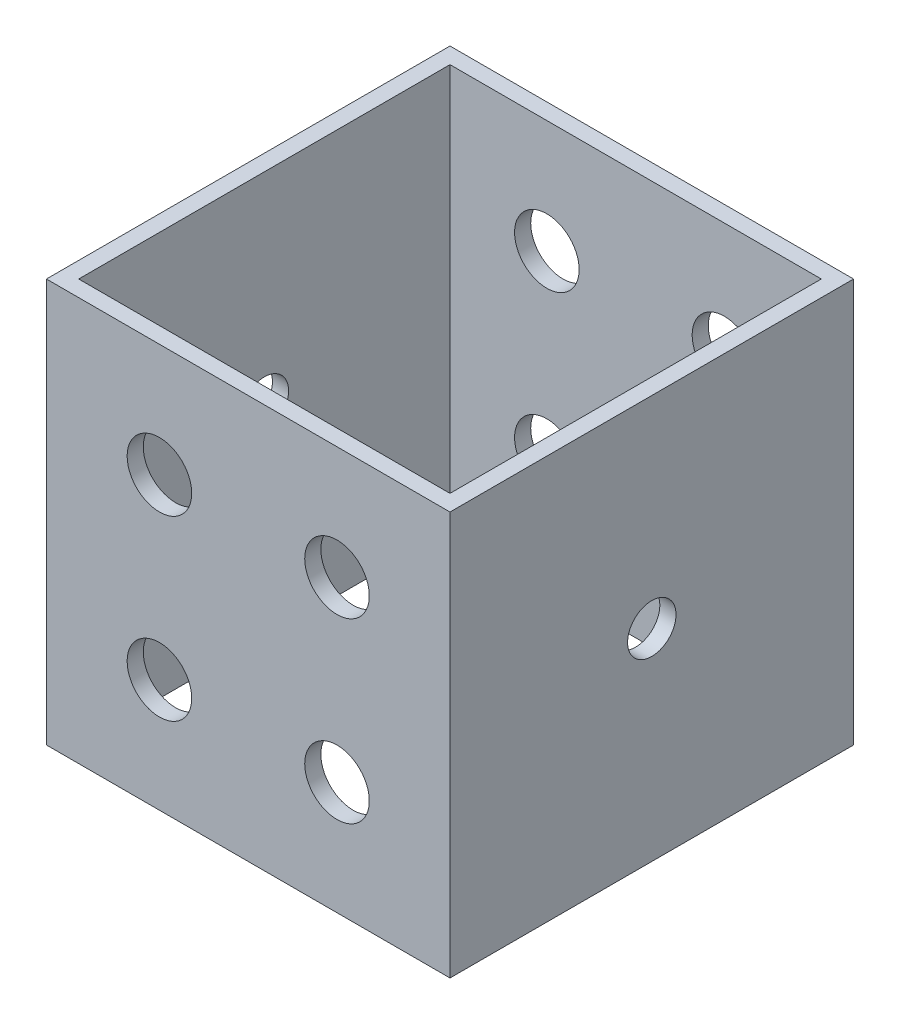
ISO-10303-21;
HEADER;
FILE_DESCRIPTION(('STEP AP214'),'2;1');
FILE_NAME('part.step','',(''),(''),'','','');
FILE_SCHEMA(('AUTOMOTIVE_DESIGN { 1 0 10303 214 1 1 1 1 }'));
ENDSEC;
DATA;
#1=APPLICATION_CONTEXT('core data for automotive mechanical design processes');
#2=APPLICATION_PROTOCOL_DEFINITION('international standard','automotive_design',2000,#1);
#3=PRODUCT_CONTEXT('',#1,'mechanical');
#4=PRODUCT('Part','Part','',(#3));
#5=PRODUCT_RELATED_PRODUCT_CATEGORY('part','',(#4));
#6=PRODUCT_DEFINITION_FORMATION('','',#4);
#7=PRODUCT_DEFINITION_CONTEXT('part definition',#1,'design');
#8=PRODUCT_DEFINITION('design','',#6,#7);
#9=PRODUCT_DEFINITION_SHAPE('','',#8);
#10=(LENGTH_UNIT() NAMED_UNIT(*) SI_UNIT(.MILLI.,.METRE.));
#11=(NAMED_UNIT(*) PLANE_ANGLE_UNIT() SI_UNIT($,.RADIAN.));
#12=(NAMED_UNIT(*) SI_UNIT($,.STERADIAN.) SOLID_ANGLE_UNIT());
#13=UNCERTAINTY_MEASURE_WITH_UNIT(LENGTH_MEASURE(1.E-05),#10,'distance_accuracy_value','');
#14=(GEOMETRIC_REPRESENTATION_CONTEXT(3) GLOBAL_UNCERTAINTY_ASSIGNED_CONTEXT((#13)) GLOBAL_UNIT_ASSIGNED_CONTEXT((#10,
#11,#12)) REPRESENTATION_CONTEXT('',''));
#15=CARTESIAN_POINT('',(0.,0.,0.));
#16=DIRECTION('',(0.,0.,1.));
#17=DIRECTION('',(1.,0.,0.));
#18=AXIS2_PLACEMENT_3D('',#15,#16,#17);
#19=CARTESIAN_POINT('',(12.5,-12.5,-12.5));
#20=DIRECTION('',(1.,0.,0.));
#21=DIRECTION('',(0.,0.,-1.));
#22=AXIS2_PLACEMENT_3D('',#19,#20,#21);
#23=PLANE('',#22);
#24=CARTESIAN_POINT('',(12.5,0.,0.));
#25=DIRECTION('',(1.,0.,0.));
#26=DIRECTION('',(0.,0.,-1.));
#27=AXIS2_PLACEMENT_3D('',#24,#25,#26);
#28=CIRCLE('',#27,1.5);
#29=CARTESIAN_POINT('',(12.5,0.,-1.5));
#30=VERTEX_POINT('',#29);
#31=EDGE_CURVE('E219',#30,#30,#28,.T.);
#32=ORIENTED_EDGE('',*,*,#31,.F.);
#33=EDGE_LOOP('',(#32));
#34=FACE_BOUND('',#33,.T.);
#35=DIRECTION('',(0.,1.,0.));
#36=VECTOR('',#35,1.);
#37=CARTESIAN_POINT('',(12.5,-12.5,-12.5));
#38=LINE('',#37,#36);
#39=CARTESIAN_POINT('',(12.5,-12.5,-12.5));
#40=VERTEX_POINT('',#39);
#41=CARTESIAN_POINT('',(12.5,12.5,-12.5));
#42=VERTEX_POINT('',#41);
#43=EDGE_CURVE('E161',#40,#42,#38,.T.);
#44=ORIENTED_EDGE('',*,*,#43,.T.);
#45=DIRECTION('',(0.,0.,-1.));
#46=VECTOR('',#45,1.);
#47=CARTESIAN_POINT('',(12.5,12.5,-12.5));
#48=LINE('',#47,#46);
#49=CARTESIAN_POINT('',(12.5,12.5,12.5));
#50=VERTEX_POINT('',#49);
#51=EDGE_CURVE('E129',#50,#42,#48,.T.);
#52=ORIENTED_EDGE('',*,*,#51,.F.);
#53=DIRECTION('',(0.,1.,0.));
#54=VECTOR('',#53,1.);
#55=CARTESIAN_POINT('',(12.5,-12.5,12.5));
#56=LINE('',#55,#54);
#57=CARTESIAN_POINT('',(12.5,-12.5,12.5));
#58=VERTEX_POINT('',#57);
#59=EDGE_CURVE('E11',#58,#50,#56,.T.);
#60=ORIENTED_EDGE('',*,*,#59,.F.);
#61=DIRECTION('',(0.,0.,-1.));
#62=VECTOR('',#61,1.);
#63=CARTESIAN_POINT('',(12.5,-12.5,-12.5));
#64=LINE('',#63,#62);
#65=EDGE_CURVE('E148',#58,#40,#64,.T.);
#66=ORIENTED_EDGE('',*,*,#65,.T.);
#67=EDGE_LOOP('',(#44,#52,#60,#66));
#68=FACE_BOUND('',#67,.T.);
#69=ADVANCED_FACE('F32',(#34,#68),#23,.T.);
#70=CARTESIAN_POINT('',(-12.5,-12.5,12.5));
#71=DIRECTION('',(0.,0.,1.));
#72=DIRECTION('',(1.,0.,0.));
#73=AXIS2_PLACEMENT_3D('',#70,#71,#72);
#74=PLANE('',#73);
#75=CARTESIAN_POINT('',(5.49999999999999,5.5,12.5));
#76=DIRECTION('',(0.,0.,-1.));
#77=DIRECTION('',(-1.,0.,0.));
#78=AXIS2_PLACEMENT_3D('',#75,#76,#77);
#79=CIRCLE('',#78,2.);
#80=CARTESIAN_POINT('',(3.49999999999999,5.5,12.5));
#81=VERTEX_POINT('',#80);
#82=EDGE_CURVE('E202',#81,#81,#79,.T.);
#83=ORIENTED_EDGE('',*,*,#82,.T.);
#84=EDGE_LOOP('',(#83));
#85=FACE_BOUND('',#84,.T.);
#86=CARTESIAN_POINT('',(5.49999999999999,-5.5,12.5));
#87=DIRECTION('',(0.,0.,-1.));
#88=DIRECTION('',(-1.,0.,0.));
#89=AXIS2_PLACEMENT_3D('',#86,#87,#88);
#90=CIRCLE('',#89,2.);
#91=CARTESIAN_POINT('',(3.49999999999999,-5.5,12.5));
#92=VERTEX_POINT('',#91);
#93=EDGE_CURVE('E209',#92,#92,#90,.T.);
#94=ORIENTED_EDGE('',*,*,#93,.T.);
#95=EDGE_LOOP('',(#94));
#96=FACE_BOUND('',#95,.T.);
#97=CARTESIAN_POINT('',(-5.50000000000001,-5.5,12.5));
#98=DIRECTION('',(0.,0.,-1.));
#99=DIRECTION('',(-1.,0.,0.));
#100=AXIS2_PLACEMENT_3D('',#97,#98,#99);
#101=CIRCLE('',#100,2.);
#102=CARTESIAN_POINT('',(-7.50000000000001,-5.5,12.5));
#103=VERTEX_POINT('',#102);
#104=EDGE_CURVE('E196',#103,#103,#101,.T.);
#105=ORIENTED_EDGE('',*,*,#104,.T.);
#106=EDGE_LOOP('',(#105));
#107=FACE_BOUND('',#106,.T.);
#108=CARTESIAN_POINT('',(-5.50000000000001,5.5,12.5));
#109=DIRECTION('',(0.,0.,-1.));
#110=DIRECTION('',(-1.,0.,0.));
#111=AXIS2_PLACEMENT_3D('',#108,#109,#110);
#112=CIRCLE('',#111,2.);
#113=CARTESIAN_POINT('',(-7.50000000000001,5.5,12.5));
#114=VERTEX_POINT('',#113);
#115=EDGE_CURVE('E171',#114,#114,#112,.T.);
#116=ORIENTED_EDGE('',*,*,#115,.T.);
#117=EDGE_LOOP('',(#116));
#118=FACE_BOUND('',#117,.T.);
#119=ORIENTED_EDGE('',*,*,#59,.T.);
#120=DIRECTION('',(1.,0.,0.));
#121=VECTOR('',#120,1.);
#122=CARTESIAN_POINT('',(-12.5,12.5,12.5));
#123=LINE('',#122,#121);
#124=CARTESIAN_POINT('',(-12.5,12.5,12.5));
#125=VERTEX_POINT('',#124);
#126=EDGE_CURVE('E138',#125,#50,#123,.T.);
#127=ORIENTED_EDGE('',*,*,#126,.F.);
#128=DIRECTION('',(0.,1.,0.));
#129=VECTOR('',#128,1.);
#130=CARTESIAN_POINT('',(-12.5,-12.5,12.5));
#131=LINE('',#130,#129);
#132=CARTESIAN_POINT('',(-12.5,-12.5,12.5));
#133=VERTEX_POINT('',#132);
#134=EDGE_CURVE('E40',#133,#125,#131,.T.);
#135=ORIENTED_EDGE('',*,*,#134,.F.);
#136=DIRECTION('',(1.,0.,0.));
#137=VECTOR('',#136,1.);
#138=CARTESIAN_POINT('',(-12.5,-12.5,12.5));
#139=LINE('',#138,#137);
#140=EDGE_CURVE('E159',#133,#58,#139,.T.);
#141=ORIENTED_EDGE('',*,*,#140,.T.);
#142=EDGE_LOOP('',(#119,#127,#135,#141));
#143=FACE_BOUND('',#142,.T.);
#144=ADVANCED_FACE('F248',(#85,#96,#107,#118,#143),#74,.T.);
#145=CARTESIAN_POINT('',(-12.5,-12.5,-12.5));
#146=DIRECTION('',(-1.,0.,0.));
#147=DIRECTION('',(0.,0.,1.));
#148=AXIS2_PLACEMENT_3D('',#145,#146,#147);
#149=PLANE('',#148);
#150=CARTESIAN_POINT('',(-12.5,0.,0.));
#151=DIRECTION('',(1.,0.,0.));
#152=DIRECTION('',(0.,0.,-1.));
#153=AXIS2_PLACEMENT_3D('',#150,#151,#152);
#154=CIRCLE('',#153,1.5);
#155=CARTESIAN_POINT('',(-12.5,0.,-1.5));
#156=VERTEX_POINT('',#155);
#157=EDGE_CURVE('E222',#156,#156,#154,.T.);
#158=ORIENTED_EDGE('',*,*,#157,.T.);
#159=EDGE_LOOP('',(#158));
#160=FACE_BOUND('',#159,.T.);
#161=ORIENTED_EDGE('',*,*,#134,.T.);
#162=DIRECTION('',(0.,0.,1.));
#163=VECTOR('',#162,1.);
#164=CARTESIAN_POINT('',(-12.5,12.5,-12.5));
#165=LINE('',#164,#163);
#166=CARTESIAN_POINT('',(-12.5,12.5,-12.5));
#167=VERTEX_POINT('',#166);
#168=EDGE_CURVE('E135',#167,#125,#165,.T.);
#169=ORIENTED_EDGE('',*,*,#168,.F.);
#170=DIRECTION('',(0.,1.,0.));
#171=VECTOR('',#170,1.);
#172=CARTESIAN_POINT('',(-12.5,-12.5,-12.5));
#173=LINE('',#172,#171);
#174=CARTESIAN_POINT('',(-12.5,-12.5,-12.5));
#175=VERTEX_POINT('',#174);
#176=EDGE_CURVE('E164',#175,#167,#173,.T.);
#177=ORIENTED_EDGE('',*,*,#176,.F.);
#178=DIRECTION('',(0.,0.,1.));
#179=VECTOR('',#178,1.);
#180=CARTESIAN_POINT('',(-12.5,-12.5,-12.5));
#181=LINE('',#180,#179);
#182=EDGE_CURVE('E156',#175,#133,#181,.T.);
#183=ORIENTED_EDGE('',*,*,#182,.T.);
#184=EDGE_LOOP('',(#161,#169,#177,#183));
#185=FACE_BOUND('',#184,.T.);
#186=ADVANCED_FACE('F253',(#160,#185),#149,.T.);
#187=CARTESIAN_POINT('',(-12.5,-12.5,-12.5));
#188=DIRECTION('',(0.,0.,-1.));
#189=DIRECTION('',(-1.,0.,0.));
#190=AXIS2_PLACEMENT_3D('',#187,#188,#189);
#191=PLANE('',#190);
#192=CARTESIAN_POINT('',(5.49999999999999,5.5,-12.5));
#193=DIRECTION('',(0.,0.,-1.));
#194=DIRECTION('',(-1.,0.,0.));
#195=AXIS2_PLACEMENT_3D('',#192,#193,#194);
#196=CIRCLE('',#195,2.);
#197=CARTESIAN_POINT('',(3.49999999999999,5.5,-12.5));
#198=VERTEX_POINT('',#197);
#199=EDGE_CURVE('E199',#198,#198,#196,.T.);
#200=ORIENTED_EDGE('',*,*,#199,.F.);
#201=EDGE_LOOP('',(#200));
#202=FACE_BOUND('',#201,.T.);
#203=CARTESIAN_POINT('',(5.49999999999999,-5.5,-12.5));
#204=DIRECTION('',(0.,0.,-1.));
#205=DIRECTION('',(-1.,0.,0.));
#206=AXIS2_PLACEMENT_3D('',#203,#204,#205);
#207=CIRCLE('',#206,2.);
#208=CARTESIAN_POINT('',(3.49999999999999,-5.5,-12.5));
#209=VERTEX_POINT('',#208);
#210=EDGE_CURVE('E206',#209,#209,#207,.T.);
#211=ORIENTED_EDGE('',*,*,#210,.F.);
#212=EDGE_LOOP('',(#211));
#213=FACE_BOUND('',#212,.T.);
#214=CARTESIAN_POINT('',(-5.50000000000001,-5.5,-12.5));
#215=DIRECTION('',(0.,0.,-1.));
#216=DIRECTION('',(-1.,0.,0.));
#217=AXIS2_PLACEMENT_3D('',#214,#215,#216);
#218=CIRCLE('',#217,2.);
#219=CARTESIAN_POINT('',(-7.50000000000001,-5.5,-12.5));
#220=VERTEX_POINT('',#219);
#221=EDGE_CURVE('E212',#220,#220,#218,.T.);
#222=ORIENTED_EDGE('',*,*,#221,.F.);
#223=EDGE_LOOP('',(#222));
#224=FACE_BOUND('',#223,.T.);
#225=CARTESIAN_POINT('',(-5.50000000000001,5.5,-12.5));
#226=DIRECTION('',(0.,0.,-1.));
#227=DIRECTION('',(-1.,0.,0.));
#228=AXIS2_PLACEMENT_3D('',#225,#226,#227);
#229=CIRCLE('',#228,2.);
#230=CARTESIAN_POINT('',(-7.50000000000001,5.5,-12.5));
#231=VERTEX_POINT('',#230);
#232=EDGE_CURVE('E193',#231,#231,#229,.T.);
#233=ORIENTED_EDGE('',*,*,#232,.F.);
#234=EDGE_LOOP('',(#233));
#235=FACE_BOUND('',#234,.T.);
#236=ORIENTED_EDGE('',*,*,#176,.T.);
#237=DIRECTION('',(-1.,0.,0.));
#238=VECTOR('',#237,1.);
#239=CARTESIAN_POINT('',(-12.5,12.5,-12.5));
#240=LINE('',#239,#238);
#241=EDGE_CURVE('E132',#42,#167,#240,.T.);
#242=ORIENTED_EDGE('',*,*,#241,.F.);
#243=ORIENTED_EDGE('',*,*,#43,.F.);
#244=DIRECTION('',(-1.,0.,0.));
#245=VECTOR('',#244,1.);
#246=CARTESIAN_POINT('',(-12.5,-12.5,-12.5));
#247=LINE('',#246,#245);
#248=EDGE_CURVE('E153',#40,#175,#247,.T.);
#249=ORIENTED_EDGE('',*,*,#248,.T.);
#250=EDGE_LOOP('',(#236,#242,#243,#249));
#251=FACE_BOUND('',#250,.T.);
#252=ADVANCED_FACE('F260',(#202,#213,#224,#235,#251),#191,.T.);
#253=CARTESIAN_POINT('',(0.,-12.5,0.));
#254=DIRECTION('',(0.,1.,0.));
#255=DIRECTION('',(0.,0.,1.));
#256=AXIS2_PLACEMENT_3D('',#253,#254,#255);
#257=PLANE('',#256);
#258=DIRECTION('',(1.,0.,0.));
#259=VECTOR('',#258,1.);
#260=CARTESIAN_POINT('',(-11.5,-12.5,11.5));
#261=LINE('',#260,#259);
#262=CARTESIAN_POINT('',(-11.5,-12.5,11.5));
#263=VERTEX_POINT('',#262);
#264=CARTESIAN_POINT('',(11.5,-12.5,11.5));
#265=VERTEX_POINT('',#264);
#266=EDGE_CURVE('E109',#263,#265,#261,.T.);
#267=ORIENTED_EDGE('',*,*,#266,.T.);
#268=DIRECTION('',(0.,0.,-1.));
#269=VECTOR('',#268,1.);
#270=CARTESIAN_POINT('',(11.5,-12.5,-11.5));
#271=LINE('',#270,#269);
#272=CARTESIAN_POINT('',(11.5,-12.5,-11.5));
#273=VERTEX_POINT('',#272);
#274=EDGE_CURVE('E141',#265,#273,#271,.T.);
#275=ORIENTED_EDGE('',*,*,#274,.T.);
#276=DIRECTION('',(-1.,0.,0.));
#277=VECTOR('',#276,1.);
#278=CARTESIAN_POINT('',(-11.5,-12.5,-11.5));
#279=LINE('',#278,#277);
#280=CARTESIAN_POINT('',(-11.5,-12.5,-11.5));
#281=VERTEX_POINT('',#280);
#282=EDGE_CURVE('E104',#273,#281,#279,.T.);
#283=ORIENTED_EDGE('',*,*,#282,.T.);
#284=DIRECTION('',(0.,0.,1.));
#285=VECTOR('',#284,1.);
#286=CARTESIAN_POINT('',(-11.5,-12.5,-11.5));
#287=LINE('',#286,#285);
#288=EDGE_CURVE('E48',#281,#263,#287,.T.);
#289=ORIENTED_EDGE('',*,*,#288,.T.);
#290=EDGE_LOOP('',(#267,#275,#283,#289));
#291=FACE_BOUND('',#290,.T.);
#292=ORIENTED_EDGE('',*,*,#65,.F.);
#293=ORIENTED_EDGE('',*,*,#140,.F.);
#294=ORIENTED_EDGE('',*,*,#182,.F.);
#295=ORIENTED_EDGE('',*,*,#248,.F.);
#296=EDGE_LOOP('',(#292,#293,#294,#295));
#297=FACE_BOUND('',#296,.T.);
#298=ADVANCED_FACE('F268',(#291,#297),#257,.F.);
#299=CARTESIAN_POINT('',(11.5,-12.5,-11.5));
#300=DIRECTION('',(1.,0.,0.));
#301=DIRECTION('',(0.,0.,-1.));
#302=AXIS2_PLACEMENT_3D('',#299,#300,#301);
#303=PLANE('',#302);
#304=CARTESIAN_POINT('',(11.5,0.,0.));
#305=DIRECTION('',(1.,0.,0.));
#306=DIRECTION('',(0.,0.,-1.));
#307=AXIS2_PLACEMENT_3D('',#304,#305,#306);
#308=CIRCLE('',#307,1.5);
#309=CARTESIAN_POINT('',(11.5,0.,-1.5));
#310=VERTEX_POINT('',#309);
#311=EDGE_CURVE('E203',#310,#310,#308,.T.);
#312=ORIENTED_EDGE('',*,*,#311,.T.);
#313=EDGE_LOOP('',(#312));
#314=FACE_BOUND('',#313,.T.);
#315=DIRECTION('',(0.,1.,0.));
#316=VECTOR('',#315,1.);
#317=CARTESIAN_POINT('',(11.5,-12.5,11.5));
#318=LINE('',#317,#316);
#319=CARTESIAN_POINT('',(11.5,12.5,11.5));
#320=VERTEX_POINT('',#319);
#321=EDGE_CURVE('E114',#265,#320,#318,.T.);
#322=ORIENTED_EDGE('',*,*,#321,.T.);
#323=DIRECTION('',(0.,0.,-1.));
#324=VECTOR('',#323,1.);
#325=CARTESIAN_POINT('',(11.5,12.5,-11.5));
#326=LINE('',#325,#324);
#327=CARTESIAN_POINT('',(11.5,12.5,-11.5));
#328=VERTEX_POINT('',#327);
#329=EDGE_CURVE('E112',#320,#328,#326,.T.);
#330=ORIENTED_EDGE('',*,*,#329,.T.);
#331=DIRECTION('',(0.,1.,0.));
#332=VECTOR('',#331,1.);
#333=CARTESIAN_POINT('',(11.5,-12.5,-11.5));
#334=LINE('',#333,#332);
#335=EDGE_CURVE('E97',#273,#328,#334,.T.);
#336=ORIENTED_EDGE('',*,*,#335,.F.);
#337=ORIENTED_EDGE('',*,*,#274,.F.);
#338=EDGE_LOOP('',(#322,#330,#336,#337));
#339=FACE_BOUND('',#338,.T.);
#340=ADVANCED_FACE('F113',(#314,#339),#303,.F.);
#341=CARTESIAN_POINT('',(-11.5,-12.5,11.5));
#342=DIRECTION('',(0.,0.,1.));
#343=DIRECTION('',(1.,0.,0.));
#344=AXIS2_PLACEMENT_3D('',#341,#342,#343);
#345=PLANE('',#344);
#346=CARTESIAN_POINT('',(5.49999999999999,5.5,11.5));
#347=DIRECTION('',(0.,0.,1.));
#348=DIRECTION('',(1.,0.,0.));
#349=AXIS2_PLACEMENT_3D('',#346,#347,#348);
#350=CIRCLE('',#349,2.);
#351=CARTESIAN_POINT('',(7.49999999999999,5.5,11.5));
#352=VERTEX_POINT('',#351);
#353=EDGE_CURVE('E118',#352,#352,#350,.T.);
#354=ORIENTED_EDGE('',*,*,#353,.T.);
#355=EDGE_LOOP('',(#354));
#356=FACE_BOUND('',#355,.T.);
#357=CARTESIAN_POINT('',(5.49999999999999,-5.5,11.5));
#358=DIRECTION('',(0.,0.,1.));
#359=DIRECTION('',(1.,0.,0.));
#360=AXIS2_PLACEMENT_3D('',#357,#358,#359);
#361=CIRCLE('',#360,2.);
#362=CARTESIAN_POINT('',(7.49999999999999,-5.5,11.5));
#363=VERTEX_POINT('',#362);
#364=EDGE_CURVE('E178',#363,#363,#361,.T.);
#365=ORIENTED_EDGE('',*,*,#364,.T.);
#366=EDGE_LOOP('',(#365));
#367=FACE_BOUND('',#366,.T.);
#368=CARTESIAN_POINT('',(-5.50000000000001,-5.5,11.5));
#369=DIRECTION('',(0.,0.,1.));
#370=DIRECTION('',(1.,0.,0.));
#371=AXIS2_PLACEMENT_3D('',#368,#369,#370);
#372=CIRCLE('',#371,2.);
#373=CARTESIAN_POINT('',(-3.50000000000001,-5.5,11.5));
#374=VERTEX_POINT('',#373);
#375=EDGE_CURVE('E175',#374,#374,#372,.T.);
#376=ORIENTED_EDGE('',*,*,#375,.T.);
#377=EDGE_LOOP('',(#376));
#378=FACE_BOUND('',#377,.T.);
#379=CARTESIAN_POINT('',(-5.50000000000001,5.5,11.5));
#380=DIRECTION('',(0.,0.,1.));
#381=DIRECTION('',(1.,0.,0.));
#382=AXIS2_PLACEMENT_3D('',#379,#380,#381);
#383=CIRCLE('',#382,2.);
#384=CARTESIAN_POINT('',(-3.50000000000001,5.5,11.5));
#385=VERTEX_POINT('',#384);
#386=EDGE_CURVE('E170',#385,#385,#383,.T.);
#387=ORIENTED_EDGE('',*,*,#386,.T.);
#388=EDGE_LOOP('',(#387));
#389=FACE_BOUND('',#388,.T.);
#390=DIRECTION('',(0.,1.,0.));
#391=VECTOR('',#390,1.);
#392=CARTESIAN_POINT('',(-11.5,-12.5,11.5));
#393=LINE('',#392,#391);
#394=CARTESIAN_POINT('',(-11.5,12.5,11.5));
#395=VERTEX_POINT('',#394);
#396=EDGE_CURVE('E149',#263,#395,#393,.T.);
#397=ORIENTED_EDGE('',*,*,#396,.T.);
#398=DIRECTION('',(1.,0.,0.));
#399=VECTOR('',#398,1.);
#400=CARTESIAN_POINT('',(-11.5,12.5,11.5));
#401=LINE('',#400,#399);
#402=EDGE_CURVE('E124',#395,#320,#401,.T.);
#403=ORIENTED_EDGE('',*,*,#402,.T.);
#404=ORIENTED_EDGE('',*,*,#321,.F.);
#405=ORIENTED_EDGE('',*,*,#266,.F.);
#406=EDGE_LOOP('',(#397,#403,#404,#405));
#407=FACE_BOUND('',#406,.T.);
#408=ADVANCED_FACE('F282',(#356,#367,#378,#389,#407),#345,.F.);
#409=CARTESIAN_POINT('',(-11.5,-12.5,-11.5));
#410=DIRECTION('',(-1.,0.,0.));
#411=DIRECTION('',(0.,0.,1.));
#412=AXIS2_PLACEMENT_3D('',#409,#410,#411);
#413=PLANE('',#412);
#414=CARTESIAN_POINT('',(-11.5,0.,0.));
#415=DIRECTION('',(-1.,0.,0.));
#416=DIRECTION('',(0.,0.,1.));
#417=AXIS2_PLACEMENT_3D('',#414,#415,#416);
#418=CIRCLE('',#417,1.5);
#419=CARTESIAN_POINT('',(-11.5,0.,1.5));
#420=VERTEX_POINT('',#419);
#421=EDGE_CURVE('E35',#420,#420,#418,.T.);
#422=ORIENTED_EDGE('',*,*,#421,.T.);
#423=EDGE_LOOP('',(#422));
#424=FACE_BOUND('',#423,.T.);
#425=DIRECTION('',(0.,1.,0.));
#426=VECTOR('',#425,1.);
#427=CARTESIAN_POINT('',(-11.5,-12.5,-11.5));
#428=LINE('',#427,#426);
#429=CARTESIAN_POINT('',(-11.5,12.5,-11.5));
#430=VERTEX_POINT('',#429);
#431=EDGE_CURVE('E108',#281,#430,#428,.T.);
#432=ORIENTED_EDGE('',*,*,#431,.T.);
#433=DIRECTION('',(0.,0.,1.));
#434=VECTOR('',#433,1.);
#435=CARTESIAN_POINT('',(-11.5,12.5,-11.5));
#436=LINE('',#435,#434);
#437=EDGE_CURVE('E122',#430,#395,#436,.T.);
#438=ORIENTED_EDGE('',*,*,#437,.T.);
#439=ORIENTED_EDGE('',*,*,#396,.F.);
#440=ORIENTED_EDGE('',*,*,#288,.F.);
#441=EDGE_LOOP('',(#432,#438,#439,#440));
#442=FACE_BOUND('',#441,.T.);
#443=ADVANCED_FACE('F229',(#424,#442),#413,.F.);
#444=CARTESIAN_POINT('',(-11.5,-12.5,-11.5));
#445=DIRECTION('',(0.,0.,-1.));
#446=DIRECTION('',(-1.,0.,0.));
#447=AXIS2_PLACEMENT_3D('',#444,#445,#446);
#448=PLANE('',#447);
#449=CARTESIAN_POINT('',(5.49999999999999,5.5,-11.5));
#450=DIRECTION('',(0.,0.,-1.));
#451=DIRECTION('',(-1.,0.,0.));
#452=AXIS2_PLACEMENT_3D('',#449,#450,#451);
#453=CIRCLE('',#452,2.);
#454=CARTESIAN_POINT('',(3.49999999999999,5.5,-11.5));
#455=VERTEX_POINT('',#454);
#456=EDGE_CURVE('E179',#455,#455,#453,.T.);
#457=ORIENTED_EDGE('',*,*,#456,.T.);
#458=EDGE_LOOP('',(#457));
#459=FACE_BOUND('',#458,.T.);
#460=CARTESIAN_POINT('',(5.49999999999999,-5.5,-11.5));
#461=DIRECTION('',(0.,0.,-1.));
#462=DIRECTION('',(-1.,0.,0.));
#463=AXIS2_PLACEMENT_3D('',#460,#461,#462);
#464=CIRCLE('',#463,2.);
#465=CARTESIAN_POINT('',(3.49999999999999,-5.5,-11.5));
#466=VERTEX_POINT('',#465);
#467=EDGE_CURVE('E176',#466,#466,#464,.T.);
#468=ORIENTED_EDGE('',*,*,#467,.T.);
#469=EDGE_LOOP('',(#468));
#470=FACE_BOUND('',#469,.T.);
#471=CARTESIAN_POINT('',(-5.50000000000001,-5.5,-11.5));
#472=DIRECTION('',(0.,0.,-1.));
#473=DIRECTION('',(-1.,0.,0.));
#474=AXIS2_PLACEMENT_3D('',#471,#472,#473);
#475=CIRCLE('',#474,2.);
#476=CARTESIAN_POINT('',(-7.50000000000001,-5.5,-11.5));
#477=VERTEX_POINT('',#476);
#478=EDGE_CURVE('E172',#477,#477,#475,.T.);
#479=ORIENTED_EDGE('',*,*,#478,.T.);
#480=EDGE_LOOP('',(#479));
#481=FACE_BOUND('',#480,.T.);
#482=CARTESIAN_POINT('',(-5.50000000000001,5.5,-11.5));
#483=DIRECTION('',(0.,0.,-1.));
#484=DIRECTION('',(-1.,0.,0.));
#485=AXIS2_PLACEMENT_3D('',#482,#483,#484);
#486=CIRCLE('',#485,2.);
#487=CARTESIAN_POINT('',(-7.50000000000001,5.5,-11.5));
#488=VERTEX_POINT('',#487);
#489=EDGE_CURVE('E167',#488,#488,#486,.T.);
#490=ORIENTED_EDGE('',*,*,#489,.T.);
#491=EDGE_LOOP('',(#490));
#492=FACE_BOUND('',#491,.T.);
#493=ORIENTED_EDGE('',*,*,#335,.T.);
#494=DIRECTION('',(-1.,0.,0.));
#495=VECTOR('',#494,1.);
#496=CARTESIAN_POINT('',(-11.5,12.5,-11.5));
#497=LINE('',#496,#495);
#498=EDGE_CURVE('E101',#328,#430,#497,.T.);
#499=ORIENTED_EDGE('',*,*,#498,.T.);
#500=ORIENTED_EDGE('',*,*,#431,.F.);
#501=ORIENTED_EDGE('',*,*,#282,.F.);
#502=EDGE_LOOP('',(#493,#499,#500,#501));
#503=FACE_BOUND('',#502,.T.);
#504=ADVANCED_FACE('F99',(#459,#470,#481,#492,#503),#448,.F.);
#505=CARTESIAN_POINT('',(0.,12.5,0.));
#506=DIRECTION('',(0.,1.,0.));
#507=DIRECTION('',(0.,0.,1.));
#508=AXIS2_PLACEMENT_3D('',#505,#506,#507);
#509=PLANE('',#508);
#510=ORIENTED_EDGE('',*,*,#51,.T.);
#511=ORIENTED_EDGE('',*,*,#241,.T.);
#512=ORIENTED_EDGE('',*,*,#168,.T.);
#513=ORIENTED_EDGE('',*,*,#126,.T.);
#514=EDGE_LOOP('',(#510,#511,#512,#513));
#515=FACE_BOUND('',#514,.T.);
#516=ORIENTED_EDGE('',*,*,#498,.F.);
#517=ORIENTED_EDGE('',*,*,#329,.F.);
#518=ORIENTED_EDGE('',*,*,#402,.F.);
#519=ORIENTED_EDGE('',*,*,#437,.F.);
#520=EDGE_LOOP('',(#516,#517,#518,#519));
#521=FACE_BOUND('',#520,.T.);
#522=ADVANCED_FACE('F120',(#515,#521),#509,.T.);
#523=CARTESIAN_POINT('',(-5.50000000000001,5.5,12.5));
#524=DIRECTION('',(0.,0.,-1.));
#525=DIRECTION('',(-1.,0.,0.));
#526=AXIS2_PLACEMENT_3D('',#523,#524,#525);
#527=CYLINDRICAL_SURFACE('',#526,2.);
#528=ORIENTED_EDGE('',*,*,#232,.T.);
#529=EDGE_LOOP('',(#528));
#530=FACE_BOUND('',#529,.T.);
#531=ORIENTED_EDGE('',*,*,#489,.F.);
#532=EDGE_LOOP('',(#531));
#533=FACE_BOUND('',#532,.T.);
#534=ADVANCED_FACE('F293',(#530,#533),#527,.F.);
#535=CARTESIAN_POINT('',(-5.50000000000001,-5.5,12.5));
#536=DIRECTION('',(0.,0.,-1.));
#537=DIRECTION('',(-1.,0.,0.));
#538=AXIS2_PLACEMENT_3D('',#535,#536,#537);
#539=CYLINDRICAL_SURFACE('',#538,2.);
#540=ORIENTED_EDGE('',*,*,#221,.T.);
#541=EDGE_LOOP('',(#540));
#542=FACE_BOUND('',#541,.T.);
#543=ORIENTED_EDGE('',*,*,#478,.F.);
#544=EDGE_LOOP('',(#543));
#545=FACE_BOUND('',#544,.T.);
#546=ADVANCED_FACE('F304',(#542,#545),#539,.F.);
#547=CARTESIAN_POINT('',(5.49999999999999,-5.5,12.5));
#548=DIRECTION('',(0.,0.,-1.));
#549=DIRECTION('',(-1.,0.,0.));
#550=AXIS2_PLACEMENT_3D('',#547,#548,#549);
#551=CYLINDRICAL_SURFACE('',#550,2.);
#552=ORIENTED_EDGE('',*,*,#210,.T.);
#553=EDGE_LOOP('',(#552));
#554=FACE_BOUND('',#553,.T.);
#555=ORIENTED_EDGE('',*,*,#467,.F.);
#556=EDGE_LOOP('',(#555));
#557=FACE_BOUND('',#556,.T.);
#558=ADVANCED_FACE('F301',(#554,#557),#551,.F.);
#559=CARTESIAN_POINT('',(5.49999999999999,5.5,12.5));
#560=DIRECTION('',(0.,0.,-1.));
#561=DIRECTION('',(-1.,0.,0.));
#562=AXIS2_PLACEMENT_3D('',#559,#560,#561);
#563=CYLINDRICAL_SURFACE('',#562,2.);
#564=ORIENTED_EDGE('',*,*,#199,.T.);
#565=EDGE_LOOP('',(#564));
#566=FACE_BOUND('',#565,.T.);
#567=ORIENTED_EDGE('',*,*,#456,.F.);
#568=EDGE_LOOP('',(#567));
#569=FACE_BOUND('',#568,.T.);
#570=ADVANCED_FACE('F245',(#566,#569),#563,.F.);
#571=ORIENTED_EDGE('',*,*,#115,.F.);
#572=EDGE_LOOP('',(#571));
#573=FACE_BOUND('',#572,.T.);
#574=ORIENTED_EDGE('',*,*,#386,.F.);
#575=EDGE_LOOP('',(#574));
#576=FACE_BOUND('',#575,.T.);
#577=ADVANCED_FACE('F294',(#573,#576),#527,.F.);
#578=ORIENTED_EDGE('',*,*,#104,.F.);
#579=EDGE_LOOP('',(#578));
#580=FACE_BOUND('',#579,.T.);
#581=ORIENTED_EDGE('',*,*,#375,.F.);
#582=EDGE_LOOP('',(#581));
#583=FACE_BOUND('',#582,.T.);
#584=ADVANCED_FACE('F296',(#580,#583),#539,.F.);
#585=ORIENTED_EDGE('',*,*,#93,.F.);
#586=EDGE_LOOP('',(#585));
#587=FACE_BOUND('',#586,.T.);
#588=ORIENTED_EDGE('',*,*,#364,.F.);
#589=EDGE_LOOP('',(#588));
#590=FACE_BOUND('',#589,.T.);
#591=ADVANCED_FACE('F242',(#587,#590),#551,.F.);
#592=ORIENTED_EDGE('',*,*,#82,.F.);
#593=EDGE_LOOP('',(#592));
#594=FACE_BOUND('',#593,.T.);
#595=ORIENTED_EDGE('',*,*,#353,.F.);
#596=EDGE_LOOP('',(#595));
#597=FACE_BOUND('',#596,.T.);
#598=ADVANCED_FACE('F234',(#594,#597),#563,.F.);
#599=CARTESIAN_POINT('',(-12.5,0.,0.));
#600=DIRECTION('',(1.,0.,0.));
#601=DIRECTION('',(0.,0.,-1.));
#602=AXIS2_PLACEMENT_3D('',#599,#600,#601);
#603=CYLINDRICAL_SURFACE('',#602,1.5);
#604=ORIENTED_EDGE('',*,*,#157,.F.);
#605=EDGE_LOOP('',(#604));
#606=FACE_BOUND('',#605,.T.);
#607=ORIENTED_EDGE('',*,*,#421,.F.);
#608=EDGE_LOOP('',(#607));
#609=FACE_BOUND('',#608,.T.);
#610=ADVANCED_FACE('F231',(#606,#609),#603,.F.);
#611=ORIENTED_EDGE('',*,*,#31,.T.);
#612=EDGE_LOOP('',(#611));
#613=FACE_BOUND('',#612,.T.);
#614=ORIENTED_EDGE('',*,*,#311,.F.);
#615=EDGE_LOOP('',(#614));
#616=FACE_BOUND('',#615,.T.);
#617=ADVANCED_FACE('F233',(#613,#616),#603,.F.);
#618=CLOSED_SHELL('',(#69,#144,#186,#252,#298,#340,#408,#443,#504,#522,#534,#546,#558,#570,#577,
#584,#591,#598,#610,#617));
#619=MANIFOLD_SOLID_BREP('B2',#618);
#620=ADVANCED_BREP_SHAPE_REPRESENTATION('',(#18,#619),#14);
#621=SHAPE_DEFINITION_REPRESENTATION(#9,#620);
ENDSEC;
END-ISO-10303-21;
